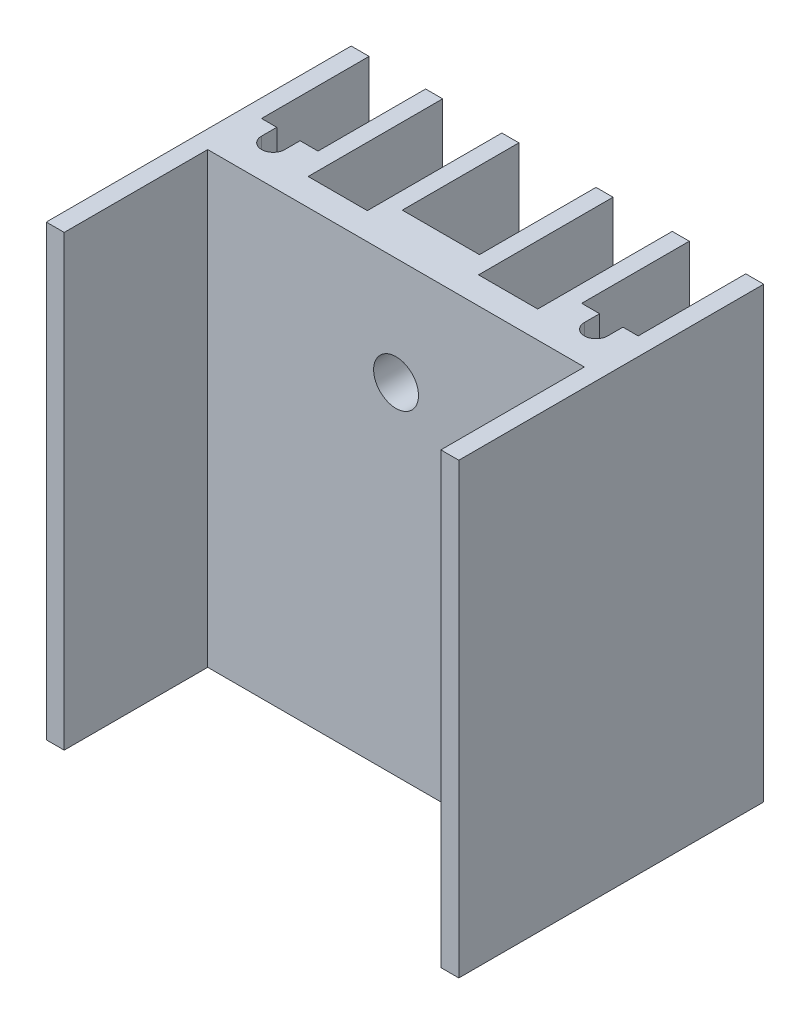
ISO-10303-21;
HEADER;
FILE_DESCRIPTION(('STEP AP214'),'2;1');
FILE_NAME('part.step','',(''),(''),'','','');
FILE_SCHEMA(('AUTOMOTIVE_DESIGN { 1 0 10303 214 1 1 1 1 }'));
ENDSEC;
DATA;
#1=APPLICATION_CONTEXT('core data for automotive mechanical design processes');
#2=APPLICATION_PROTOCOL_DEFINITION('international standard','automotive_design',2000,#1);
#3=PRODUCT_CONTEXT('',#1,'mechanical');
#4=PRODUCT('Part','Part','',(#3));
#5=PRODUCT_RELATED_PRODUCT_CATEGORY('part','',(#4));
#6=PRODUCT_DEFINITION_FORMATION('','',#4);
#7=PRODUCT_DEFINITION_CONTEXT('part definition',#1,'design');
#8=PRODUCT_DEFINITION('design','',#6,#7);
#9=PRODUCT_DEFINITION_SHAPE('','',#8);
#10=(LENGTH_UNIT() NAMED_UNIT(*) SI_UNIT(.MILLI.,.METRE.));
#11=(NAMED_UNIT(*) PLANE_ANGLE_UNIT() SI_UNIT($,.RADIAN.));
#12=(NAMED_UNIT(*) SI_UNIT($,.STERADIAN.) SOLID_ANGLE_UNIT());
#13=UNCERTAINTY_MEASURE_WITH_UNIT(LENGTH_MEASURE(1.E-05),#10,'distance_accuracy_value','');
#14=(GEOMETRIC_REPRESENTATION_CONTEXT(3) GLOBAL_UNCERTAINTY_ASSIGNED_CONTEXT((#13)) GLOBAL_UNIT_ASSIGNED_CONTEXT((#10,
#11,#12)) REPRESENTATION_CONTEXT('',''));
#15=CARTESIAN_POINT('',(0.,0.,0.));
#16=DIRECTION('',(0.,0.,1.));
#17=DIRECTION('',(1.,0.,0.));
#18=AXIS2_PLACEMENT_3D('',#15,#16,#17);
#19=CARTESIAN_POINT('',(-10.5,0.,-2.5));
#20=DIRECTION('',(0.,0.,1.));
#21=DIRECTION('',(1.,0.,0.));
#22=AXIS2_PLACEMENT_3D('',#19,#20,#21);
#23=PLANE('',#22);
#24=DIRECTION('',(1.,0.,0.));
#25=VECTOR('',#24,1.);
#26=CARTESIAN_POINT('',(-10.5,25.,-2.5));
#27=LINE('',#26,#25);
#28=CARTESIAN_POINT('',(-10.5,25.,-2.5));
#29=VERTEX_POINT('',#28);
#30=CARTESIAN_POINT('',(-9.65000000000002,25.,-2.49999999999993));
#31=VERTEX_POINT('',#30);
#32=EDGE_CURVE('E450',#29,#31,#27,.T.);
#33=ORIENTED_EDGE('',*,*,#32,.T.);
#34=DIRECTION('',(0.,1.,0.));
#35=VECTOR('',#34,1.);
#36=CARTESIAN_POINT('',(-9.65000000000002,0.,-2.49999999999993));
#37=LINE('',#36,#35);
#38=CARTESIAN_POINT('',(-9.65000000000002,0.,-2.49999999999993));
#39=VERTEX_POINT('',#38);
#40=EDGE_CURVE('E299',#39,#31,#37,.T.);
#41=ORIENTED_EDGE('',*,*,#40,.F.);
#42=DIRECTION('',(1.,0.,0.));
#43=VECTOR('',#42,1.);
#44=CARTESIAN_POINT('',(-10.5,0.,-2.5));
#45=LINE('',#44,#43);
#46=CARTESIAN_POINT('',(-10.5,0.,-2.5));
#47=VERTEX_POINT('',#46);
#48=EDGE_CURVE('E441',#47,#39,#45,.T.);
#49=ORIENTED_EDGE('',*,*,#48,.F.);
#50=DIRECTION('',(0.,1.,0.));
#51=VECTOR('',#50,1.);
#52=CARTESIAN_POINT('',(-10.5,0.,-2.5));
#53=LINE('',#52,#51);
#54=EDGE_CURVE('E446',#47,#29,#53,.T.);
#55=ORIENTED_EDGE('',*,*,#54,.T.);
#56=EDGE_LOOP('',(#33,#41,#49,#55));
#57=FACE_BOUND('',#56,.T.);
#58=ADVANCED_FACE('F33',(#57),#23,.F.);
#59=CARTESIAN_POINT('',(10.5,0.,-2.5));
#60=DIRECTION('',(0.,0.,1.));
#61=DIRECTION('',(1.,0.,0.));
#62=AXIS2_PLACEMENT_3D('',#59,#60,#61);
#63=PLANE('',#62);
#64=DIRECTION('',(1.,0.,0.));
#65=VECTOR('',#64,1.);
#66=CARTESIAN_POINT('',(10.5,0.,-2.5));
#67=LINE('',#66,#65);
#68=CARTESIAN_POINT('',(9.65,0.,-2.5));
#69=VERTEX_POINT('',#68);
#70=CARTESIAN_POINT('',(10.5,0.,-2.5));
#71=VERTEX_POINT('',#70);
#72=EDGE_CURVE('E329',#69,#71,#67,.T.);
#73=ORIENTED_EDGE('',*,*,#72,.F.);
#74=DIRECTION('',(0.,1.,0.));
#75=VECTOR('',#74,1.);
#76=CARTESIAN_POINT('',(9.65,0.,-2.5));
#77=LINE('',#76,#75);
#78=CARTESIAN_POINT('',(9.65,25.,-2.5));
#79=VERTEX_POINT('',#78);
#80=EDGE_CURVE('E317',#69,#79,#77,.T.);
#81=ORIENTED_EDGE('',*,*,#80,.T.);
#82=DIRECTION('',(1.,0.,0.));
#83=VECTOR('',#82,1.);
#84=CARTESIAN_POINT('',(10.5,25.,-2.5));
#85=LINE('',#84,#83);
#86=CARTESIAN_POINT('',(10.5,25.,-2.5));
#87=VERTEX_POINT('',#86);
#88=EDGE_CURVE('E340',#79,#87,#85,.T.);
#89=ORIENTED_EDGE('',*,*,#88,.T.);
#90=DIRECTION('',(0.,1.,0.));
#91=VECTOR('',#90,1.);
#92=CARTESIAN_POINT('',(10.5,0.,-2.5));
#93=LINE('',#92,#91);
#94=EDGE_CURVE('E349',#71,#87,#93,.T.);
#95=ORIENTED_EDGE('',*,*,#94,.F.);
#96=EDGE_LOOP('',(#73,#81,#89,#95));
#97=FACE_BOUND('',#96,.T.);
#98=ADVANCED_FACE('F632',(#97),#63,.F.);
#99=CARTESIAN_POINT('',(-11.5,25.,-8.5));
#100=DIRECTION('',(0.,0.,1.));
#101=DIRECTION('',(1.,0.,0.));
#102=AXIS2_PLACEMENT_3D('',#99,#100,#101);
#103=PLANE('',#102);
#104=DIRECTION('',(-1.,0.,0.));
#105=VECTOR('',#104,1.);
#106=CARTESIAN_POINT('',(-11.5,0.,-8.5));
#107=LINE('',#106,#105);
#108=CARTESIAN_POINT('',(11.5,0.,-8.5));
#109=VERTEX_POINT('',#108);
#110=CARTESIAN_POINT('',(10.5,0.,-8.5));
#111=VERTEX_POINT('',#110);
#112=EDGE_CURVE('E495',#109,#111,#107,.T.);
#113=ORIENTED_EDGE('',*,*,#112,.T.);
#114=DIRECTION('',(0.,1.,0.));
#115=VECTOR('',#114,1.);
#116=CARTESIAN_POINT('',(10.5,0.,-8.5));
#117=LINE('',#116,#115);
#118=CARTESIAN_POINT('',(10.5,25.,-8.5));
#119=VERTEX_POINT('',#118);
#120=EDGE_CURVE('E345',#111,#119,#117,.T.);
#121=ORIENTED_EDGE('',*,*,#120,.T.);
#122=DIRECTION('',(-1.,0.,0.));
#123=VECTOR('',#122,1.);
#124=CARTESIAN_POINT('',(-11.5,25.,-8.5));
#125=LINE('',#124,#123);
#126=CARTESIAN_POINT('',(11.5,25.,-8.5));
#127=VERTEX_POINT('',#126);
#128=EDGE_CURVE('E502',#127,#119,#125,.T.);
#129=ORIENTED_EDGE('',*,*,#128,.F.);
#130=DIRECTION('',(0.,-1.,0.));
#131=VECTOR('',#130,1.);
#132=CARTESIAN_POINT('',(11.5,25.,-8.5));
#133=LINE('',#132,#131);
#134=EDGE_CURVE('E521',#127,#109,#133,.T.);
#135=ORIENTED_EDGE('',*,*,#134,.T.);
#136=EDGE_LOOP('',(#113,#121,#129,#135));
#137=FACE_BOUND('',#136,.T.);
#138=ADVANCED_FACE('F536',(#137),#103,.F.);
#139=CARTESIAN_POINT('',(7.35,25.,-8.5));
#140=VERTEX_POINT('',#139);
#141=CARTESIAN_POINT('',(6.4,25.,-8.5));
#142=VERTEX_POINT('',#141);
#143=EDGE_CURVE('E506',#140,#142,#125,.T.);
#144=ORIENTED_EDGE('',*,*,#143,.F.);
#145=DIRECTION('',(0.,1.,0.));
#146=VECTOR('',#145,1.);
#147=CARTESIAN_POINT('',(7.35,0.,-8.5));
#148=LINE('',#147,#146);
#149=CARTESIAN_POINT('',(7.35,0.,-8.5));
#150=VERTEX_POINT('',#149);
#151=EDGE_CURVE('E337',#150,#140,#148,.T.);
#152=ORIENTED_EDGE('',*,*,#151,.F.);
#153=CARTESIAN_POINT('',(6.4,0.,-8.5));
#154=VERTEX_POINT('',#153);
#155=EDGE_CURVE('E518',#150,#154,#107,.T.);
#156=ORIENTED_EDGE('',*,*,#155,.T.);
#157=DIRECTION('',(0.,1.,0.));
#158=VECTOR('',#157,1.);
#159=CARTESIAN_POINT('',(6.4,0.,-8.5));
#160=LINE('',#159,#158);
#161=EDGE_CURVE('E373',#154,#142,#160,.T.);
#162=ORIENTED_EDGE('',*,*,#161,.T.);
#163=EDGE_LOOP('',(#144,#152,#156,#162));
#164=FACE_BOUND('',#163,.T.);
#165=ADVANCED_FACE('F588',(#164),#103,.F.);
#166=CARTESIAN_POINT('',(-2.15,25.,-8.5));
#167=VERTEX_POINT('',#166);
#168=CARTESIAN_POINT('',(-3.1,25.,-8.5));
#169=VERTEX_POINT('',#168);
#170=EDGE_CURVE('E604',#167,#169,#125,.T.);
#171=ORIENTED_EDGE('',*,*,#170,.F.);
#172=DIRECTION('',(0.,1.,0.));
#173=VECTOR('',#172,1.);
#174=CARTESIAN_POINT('',(-2.15,0.,-8.5));
#175=LINE('',#174,#173);
#176=CARTESIAN_POINT('',(-2.15,0.,-8.5));
#177=VERTEX_POINT('',#176);
#178=EDGE_CURVE('E400',#177,#167,#175,.T.);
#179=ORIENTED_EDGE('',*,*,#178,.F.);
#180=CARTESIAN_POINT('',(-3.1,0.,-8.5));
#181=VERTEX_POINT('',#180);
#182=EDGE_CURVE('E569',#177,#181,#107,.T.);
#183=ORIENTED_EDGE('',*,*,#182,.T.);
#184=DIRECTION('',(0.,1.,0.));
#185=VECTOR('',#184,1.);
#186=CARTESIAN_POINT('',(-3.1,0.,-8.5));
#187=LINE('',#186,#185);
#188=EDGE_CURVE('E430',#181,#169,#187,.T.);
#189=ORIENTED_EDGE('',*,*,#188,.T.);
#190=EDGE_LOOP('',(#171,#179,#183,#189));
#191=FACE_BOUND('',#190,.T.);
#192=ADVANCED_FACE('F622',(#191),#103,.F.);
#193=CARTESIAN_POINT('',(-6.4,25.,-8.5));
#194=VERTEX_POINT('',#193);
#195=CARTESIAN_POINT('',(-7.35,25.,-8.5));
#196=VERTEX_POINT('',#195);
#197=EDGE_CURVE('E606',#194,#196,#125,.T.);
#198=ORIENTED_EDGE('',*,*,#197,.F.);
#199=DIRECTION('',(0.,1.,0.));
#200=VECTOR('',#199,1.);
#201=CARTESIAN_POINT('',(-6.4,0.,-8.5));
#202=LINE('',#201,#200);
#203=CARTESIAN_POINT('',(-6.4,0.,-8.5));
#204=VERTEX_POINT('',#203);
#205=EDGE_CURVE('E427',#204,#194,#202,.T.);
#206=ORIENTED_EDGE('',*,*,#205,.F.);
#207=CARTESIAN_POINT('',(-7.35,0.,-8.5));
#208=VERTEX_POINT('',#207);
#209=EDGE_CURVE('E568',#204,#208,#107,.T.);
#210=ORIENTED_EDGE('',*,*,#209,.T.);
#211=DIRECTION('',(0.,1.,0.));
#212=VECTOR('',#211,1.);
#213=CARTESIAN_POINT('',(-7.35,0.,-8.5));
#214=LINE('',#213,#212);
#215=EDGE_CURVE('E458',#208,#196,#214,.T.);
#216=ORIENTED_EDGE('',*,*,#215,.T.);
#217=EDGE_LOOP('',(#198,#206,#210,#216));
#218=FACE_BOUND('',#217,.T.);
#219=ADVANCED_FACE('F619',(#218),#103,.F.);
#220=CARTESIAN_POINT('',(-10.5,25.,-8.5));
#221=VERTEX_POINT('',#220);
#222=CARTESIAN_POINT('',(-11.5,25.,-8.5));
#223=VERTEX_POINT('',#222);
#224=EDGE_CURVE('E501',#221,#223,#125,.T.);
#225=ORIENTED_EDGE('',*,*,#224,.F.);
#226=DIRECTION('',(0.,1.,0.));
#227=VECTOR('',#226,1.);
#228=CARTESIAN_POINT('',(-10.5,0.,-8.5));
#229=LINE('',#228,#227);
#230=CARTESIAN_POINT('',(-10.5,0.,-8.5));
#231=VERTEX_POINT('',#230);
#232=EDGE_CURVE('E455',#231,#221,#229,.T.);
#233=ORIENTED_EDGE('',*,*,#232,.F.);
#234=CARTESIAN_POINT('',(-11.5,0.,-8.5));
#235=VERTEX_POINT('',#234);
#236=EDGE_CURVE('E515',#231,#235,#107,.T.);
#237=ORIENTED_EDGE('',*,*,#236,.T.);
#238=DIRECTION('',(0.,-1.,0.));
#239=VECTOR('',#238,1.);
#240=CARTESIAN_POINT('',(-11.5,25.,-8.5));
#241=LINE('',#240,#239);
#242=EDGE_CURVE('E505',#223,#235,#241,.T.);
#243=ORIENTED_EDGE('',*,*,#242,.F.);
#244=EDGE_LOOP('',(#225,#233,#237,#243));
#245=FACE_BOUND('',#244,.T.);
#246=ADVANCED_FACE('F621',(#245),#103,.F.);
#247=CARTESIAN_POINT('',(-11.5,25.,8.5));
#248=DIRECTION('',(0.,0.,-1.));
#249=DIRECTION('',(-1.,0.,0.));
#250=AXIS2_PLACEMENT_3D('',#247,#248,#249);
#251=PLANE('',#250);
#252=DIRECTION('',(1.,0.,0.));
#253=VECTOR('',#252,1.);
#254=CARTESIAN_POINT('',(-11.5,0.,8.5));
#255=LINE('',#254,#253);
#256=CARTESIAN_POINT('',(-11.5,0.,8.5));
#257=VERTEX_POINT('',#256);
#258=CARTESIAN_POINT('',(-10.5,0.,8.5));
#259=VERTEX_POINT('',#258);
#260=EDGE_CURVE('E510',#257,#259,#255,.T.);
#261=ORIENTED_EDGE('',*,*,#260,.T.);
#262=DIRECTION('',(0.,1.,0.));
#263=VECTOR('',#262,1.);
#264=CARTESIAN_POINT('',(-10.5,0.,8.5));
#265=LINE('',#264,#263);
#266=CARTESIAN_POINT('',(-10.5,25.,8.5));
#267=VERTEX_POINT('',#266);
#268=EDGE_CURVE('E475',#259,#267,#265,.T.);
#269=ORIENTED_EDGE('',*,*,#268,.T.);
#270=DIRECTION('',(1.,0.,0.));
#271=VECTOR('',#270,1.);
#272=CARTESIAN_POINT('',(-11.5,25.,8.5));
#273=LINE('',#272,#271);
#274=CARTESIAN_POINT('',(-11.5,25.,8.5));
#275=VERTEX_POINT('',#274);
#276=EDGE_CURVE('E496',#275,#267,#273,.T.);
#277=ORIENTED_EDGE('',*,*,#276,.F.);
#278=DIRECTION('',(0.,-1.,0.));
#279=VECTOR('',#278,1.);
#280=CARTESIAN_POINT('',(-11.5,25.,8.5));
#281=LINE('',#280,#279);
#282=EDGE_CURVE('E11',#275,#257,#281,.T.);
#283=ORIENTED_EDGE('',*,*,#282,.T.);
#284=EDGE_LOOP('',(#261,#269,#277,#283));
#285=FACE_BOUND('',#284,.T.);
#286=ADVANCED_FACE('F557',(#285),#251,.F.);
#287=CARTESIAN_POINT('',(-11.5,25.,-8.5));
#288=DIRECTION('',(1.,0.,0.));
#289=DIRECTION('',(0.,0.,-1.));
#290=AXIS2_PLACEMENT_3D('',#287,#288,#289);
#291=PLANE('',#290);
#292=DIRECTION('',(0.,0.,1.));
#293=VECTOR('',#292,1.);
#294=CARTESIAN_POINT('',(-11.5,0.,-8.5));
#295=LINE('',#294,#293);
#296=EDGE_CURVE('E484',#235,#257,#295,.T.);
#297=ORIENTED_EDGE('',*,*,#296,.T.);
#298=ORIENTED_EDGE('',*,*,#282,.F.);
#299=DIRECTION('',(0.,0.,1.));
#300=VECTOR('',#299,1.);
#301=CARTESIAN_POINT('',(-11.5,25.,-8.5));
#302=LINE('',#301,#300);
#303=EDGE_CURVE('E491',#223,#275,#302,.T.);
#304=ORIENTED_EDGE('',*,*,#303,.F.);
#305=ORIENTED_EDGE('',*,*,#242,.T.);
#306=EDGE_LOOP('',(#297,#298,#304,#305));
#307=FACE_BOUND('',#306,.T.);
#308=ADVANCED_FACE('F35',(#307),#291,.F.);
#309=CARTESIAN_POINT('',(10.5,25.,8.5));
#310=VERTEX_POINT('',#309);
#311=CARTESIAN_POINT('',(11.5,25.,8.5));
#312=VERTEX_POINT('',#311);
#313=EDGE_CURVE('E494',#310,#312,#273,.T.);
#314=ORIENTED_EDGE('',*,*,#313,.F.);
#315=DIRECTION('',(0.,1.,0.));
#316=VECTOR('',#315,1.);
#317=CARTESIAN_POINT('',(10.5,0.,8.5));
#318=LINE('',#317,#316);
#319=CARTESIAN_POINT('',(10.5,0.,8.5));
#320=VERTEX_POINT('',#319);
#321=EDGE_CURVE('E487',#320,#310,#318,.T.);
#322=ORIENTED_EDGE('',*,*,#321,.F.);
#323=CARTESIAN_POINT('',(11.5,0.,8.5));
#324=VERTEX_POINT('',#323);
#325=EDGE_CURVE('E509',#320,#324,#255,.T.);
#326=ORIENTED_EDGE('',*,*,#325,.T.);
#327=DIRECTION('',(0.,-1.,0.));
#328=VECTOR('',#327,1.);
#329=CARTESIAN_POINT('',(11.5,25.,8.5));
#330=LINE('',#329,#328);
#331=EDGE_CURVE('E41',#312,#324,#330,.T.);
#332=ORIENTED_EDGE('',*,*,#331,.F.);
#333=EDGE_LOOP('',(#314,#322,#326,#332));
#334=FACE_BOUND('',#333,.T.);
#335=ADVANCED_FACE('F546',(#334),#251,.F.);
#336=CARTESIAN_POINT('',(11.5,25.,-8.5));
#337=DIRECTION('',(-1.,0.,0.));
#338=DIRECTION('',(0.,0.,1.));
#339=AXIS2_PLACEMENT_3D('',#336,#337,#338);
#340=PLANE('',#339);
#341=DIRECTION('',(0.,0.,-1.));
#342=VECTOR('',#341,1.);
#343=CARTESIAN_POINT('',(11.5,0.,-8.5));
#344=LINE('',#343,#342);
#345=EDGE_CURVE('E513',#324,#109,#344,.T.);
#346=ORIENTED_EDGE('',*,*,#345,.T.);
#347=ORIENTED_EDGE('',*,*,#134,.F.);
#348=DIRECTION('',(0.,0.,-1.));
#349=VECTOR('',#348,1.);
#350=CARTESIAN_POINT('',(11.5,25.,-8.5));
#351=LINE('',#350,#349);
#352=EDGE_CURVE('E499',#312,#127,#351,.T.);
#353=ORIENTED_EDGE('',*,*,#352,.F.);
#354=ORIENTED_EDGE('',*,*,#331,.T.);
#355=EDGE_LOOP('',(#346,#347,#353,#354));
#356=FACE_BOUND('',#355,.T.);
#357=ADVANCED_FACE('F528',(#356),#340,.F.);
#358=CARTESIAN_POINT('',(3.1,25.,-8.5));
#359=VERTEX_POINT('',#358);
#360=CARTESIAN_POINT('',(2.15,25.,-8.5));
#361=VERTEX_POINT('',#360);
#362=EDGE_CURVE('E603',#359,#361,#125,.T.);
#363=ORIENTED_EDGE('',*,*,#362,.F.);
#364=DIRECTION('',(0.,1.,0.));
#365=VECTOR('',#364,1.);
#366=CARTESIAN_POINT('',(3.1,0.,-8.5));
#367=LINE('',#366,#365);
#368=CARTESIAN_POINT('',(3.1,0.,-8.5));
#369=VERTEX_POINT('',#368);
#370=EDGE_CURVE('E365',#369,#359,#367,.T.);
#371=ORIENTED_EDGE('',*,*,#370,.F.);
#372=CARTESIAN_POINT('',(2.15,0.,-8.5));
#373=VERTEX_POINT('',#372);
#374=EDGE_CURVE('E574',#369,#373,#107,.T.);
#375=ORIENTED_EDGE('',*,*,#374,.T.);
#376=DIRECTION('',(0.,1.,0.));
#377=VECTOR('',#376,1.);
#378=CARTESIAN_POINT('',(2.15,0.,-8.5));
#379=LINE('',#378,#377);
#380=EDGE_CURVE('E403',#373,#361,#379,.T.);
#381=ORIENTED_EDGE('',*,*,#380,.T.);
#382=EDGE_LOOP('',(#363,#371,#375,#381));
#383=FACE_BOUND('',#382,.T.);
#384=ADVANCED_FACE('F628',(#383),#103,.F.);
#385=CARTESIAN_POINT('',(0.,25.,0.));
#386=DIRECTION('',(0.,1.,0.));
#387=DIRECTION('',(0.,0.,1.));
#388=AXIS2_PLACEMENT_3D('',#385,#386,#387);
#389=PLANE('',#388);
#390=DIRECTION('',(0.,0.,1.));
#391=VECTOR('',#390,1.);
#392=CARTESIAN_POINT('',(-9.65000000000001,25.,-1.64999999999993));
#393=LINE('',#392,#391);
#394=CARTESIAN_POINT('',(-9.65000000000001,25.,-1.64999999999993));
#395=VERTEX_POINT('',#394);
#396=EDGE_CURVE('E285',#31,#395,#393,.T.);
#397=ORIENTED_EDGE('',*,*,#396,.F.);
#398=ORIENTED_EDGE('',*,*,#32,.F.);
#399=DIRECTION('',(0.,0.,1.));
#400=VECTOR('',#399,1.);
#401=CARTESIAN_POINT('',(-10.5,25.,-8.5));
#402=LINE('',#401,#400);
#403=EDGE_CURVE('E429',#221,#29,#402,.T.);
#404=ORIENTED_EDGE('',*,*,#403,.F.);
#405=ORIENTED_EDGE('',*,*,#224,.T.);
#406=ORIENTED_EDGE('',*,*,#303,.T.);
#407=ORIENTED_EDGE('',*,*,#276,.T.);
#408=DIRECTION('',(0.,0.,1.));
#409=VECTOR('',#408,1.);
#410=CARTESIAN_POINT('',(-10.5,25.,8.5));
#411=LINE('',#410,#409);
#412=CARTESIAN_POINT('',(-10.5,25.,0.5));
#413=VERTEX_POINT('',#412);
#414=EDGE_CURVE('E457',#413,#267,#411,.T.);
#415=ORIENTED_EDGE('',*,*,#414,.F.);
#416=DIRECTION('',(-1.,0.,0.));
#417=VECTOR('',#416,1.);
#418=CARTESIAN_POINT('',(-10.5,25.,0.5));
#419=LINE('',#418,#417);
#420=CARTESIAN_POINT('',(10.5,25.,0.5));
#421=VERTEX_POINT('',#420);
#422=EDGE_CURVE('E469',#421,#413,#419,.T.);
#423=ORIENTED_EDGE('',*,*,#422,.F.);
#424=DIRECTION('',(0.,0.,-1.));
#425=VECTOR('',#424,1.);
#426=CARTESIAN_POINT('',(10.5,25.,8.5));
#427=LINE('',#426,#425);
#428=EDGE_CURVE('E477',#310,#421,#427,.T.);
#429=ORIENTED_EDGE('',*,*,#428,.F.);
#430=ORIENTED_EDGE('',*,*,#313,.T.);
#431=ORIENTED_EDGE('',*,*,#352,.T.);
#432=ORIENTED_EDGE('',*,*,#128,.T.);
#433=DIRECTION('',(0.,0.,-1.));
#434=VECTOR('',#433,1.);
#435=CARTESIAN_POINT('',(10.5,25.,-8.5));
#436=LINE('',#435,#434);
#437=EDGE_CURVE('E330',#87,#119,#436,.T.);
#438=ORIENTED_EDGE('',*,*,#437,.F.);
#439=ORIENTED_EDGE('',*,*,#88,.F.);
#440=DIRECTION('',(0.,0.,-1.));
#441=VECTOR('',#440,1.);
#442=CARTESIAN_POINT('',(9.65,25.,-1.65));
#443=LINE('',#442,#441);
#444=CARTESIAN_POINT('',(9.65,25.,-1.65));
#445=VERTEX_POINT('',#444);
#446=EDGE_CURVE('E304',#445,#79,#443,.T.);
#447=ORIENTED_EDGE('',*,*,#446,.F.);
#448=CARTESIAN_POINT('',(9.,25.,-1.65));
#449=DIRECTION('',(0.,1.,0.));
#450=DIRECTION('',(0.,0.,1.));
#451=AXIS2_PLACEMENT_3D('',#448,#449,#450);
#452=CIRCLE('',#451,0.65);
#453=CARTESIAN_POINT('',(8.35,25.,-1.65));
#454=VERTEX_POINT('',#453);
#455=EDGE_CURVE('E313',#454,#445,#452,.T.);
#456=ORIENTED_EDGE('',*,*,#455,.F.);
#457=DIRECTION('',(0.,0.,1.));
#458=VECTOR('',#457,1.);
#459=CARTESIAN_POINT('',(8.35,25.,-2.5));
#460=LINE('',#459,#458);
#461=CARTESIAN_POINT('',(8.35,25.,-2.5));
#462=VERTEX_POINT('',#461);
#463=EDGE_CURVE('E298',#462,#454,#460,.T.);
#464=ORIENTED_EDGE('',*,*,#463,.F.);
#465=CARTESIAN_POINT('',(7.35,25.,-2.5));
#466=VERTEX_POINT('',#465);
#467=EDGE_CURVE('E341',#466,#462,#85,.T.);
#468=ORIENTED_EDGE('',*,*,#467,.F.);
#469=DIRECTION('',(0.,0.,1.));
#470=VECTOR('',#469,1.);
#471=CARTESIAN_POINT('',(7.35,25.,-8.5));
#472=LINE('',#471,#470);
#473=EDGE_CURVE('E320',#140,#466,#472,.T.);
#474=ORIENTED_EDGE('',*,*,#473,.F.);
#475=ORIENTED_EDGE('',*,*,#143,.T.);
#476=DIRECTION('',(0.,0.,-1.));
#477=VECTOR('',#476,1.);
#478=CARTESIAN_POINT('',(6.4,25.,-8.5));
#479=LINE('',#478,#477);
#480=CARTESIAN_POINT('',(6.4,25.,-1.));
#481=VERTEX_POINT('',#480);
#482=EDGE_CURVE('E359',#481,#142,#479,.T.);
#483=ORIENTED_EDGE('',*,*,#482,.F.);
#484=DIRECTION('',(1.,0.,0.));
#485=VECTOR('',#484,1.);
#486=CARTESIAN_POINT('',(6.4,25.,-1.));
#487=LINE('',#486,#485);
#488=CARTESIAN_POINT('',(3.1,25.,-1.));
#489=VERTEX_POINT('',#488);
#490=EDGE_CURVE('E368',#489,#481,#487,.T.);
#491=ORIENTED_EDGE('',*,*,#490,.F.);
#492=DIRECTION('',(0.,0.,1.));
#493=VECTOR('',#492,1.);
#494=CARTESIAN_POINT('',(3.1,25.,-8.5));
#495=LINE('',#494,#493);
#496=EDGE_CURVE('E348',#359,#489,#495,.T.);
#497=ORIENTED_EDGE('',*,*,#496,.F.);
#498=ORIENTED_EDGE('',*,*,#362,.T.);
#499=DIRECTION('',(0.,0.,-1.));
#500=VECTOR('',#499,1.);
#501=CARTESIAN_POINT('',(2.15,25.,-8.5));
#502=LINE('',#501,#500);
#503=CARTESIAN_POINT('',(2.15,25.,-2.));
#504=VERTEX_POINT('',#503);
#505=EDGE_CURVE('E386',#504,#361,#502,.T.);
#506=ORIENTED_EDGE('',*,*,#505,.F.);
#507=DIRECTION('',(1.,0.,0.));
#508=VECTOR('',#507,1.);
#509=CARTESIAN_POINT('',(-2.15,25.,-2.));
#510=LINE('',#509,#508);
#511=CARTESIAN_POINT('',(-2.15,25.,-2.));
#512=VERTEX_POINT('',#511);
#513=EDGE_CURVE('E395',#512,#504,#510,.T.);
#514=ORIENTED_EDGE('',*,*,#513,.F.);
#515=DIRECTION('',(0.,0.,1.));
#516=VECTOR('',#515,1.);
#517=CARTESIAN_POINT('',(-2.15,25.,-8.5));
#518=LINE('',#517,#516);
#519=EDGE_CURVE('E376',#167,#512,#518,.T.);
#520=ORIENTED_EDGE('',*,*,#519,.F.);
#521=ORIENTED_EDGE('',*,*,#170,.T.);
#522=DIRECTION('',(0.,0.,-1.));
#523=VECTOR('',#522,1.);
#524=CARTESIAN_POINT('',(-3.1,25.,-8.5));
#525=LINE('',#524,#523);
#526=CARTESIAN_POINT('',(-3.1,25.,-1.));
#527=VERTEX_POINT('',#526);
#528=EDGE_CURVE('E413',#527,#169,#525,.T.);
#529=ORIENTED_EDGE('',*,*,#528,.F.);
#530=DIRECTION('',(1.,0.,0.));
#531=VECTOR('',#530,1.);
#532=CARTESIAN_POINT('',(-6.4,25.,-1.));
#533=LINE('',#532,#531);
#534=CARTESIAN_POINT('',(-6.4,25.,-1.));
#535=VERTEX_POINT('',#534);
#536=EDGE_CURVE('E422',#535,#527,#533,.T.);
#537=ORIENTED_EDGE('',*,*,#536,.F.);
#538=DIRECTION('',(0.,0.,1.));
#539=VECTOR('',#538,1.);
#540=CARTESIAN_POINT('',(-6.4,25.,-8.5));
#541=LINE('',#540,#539);
#542=EDGE_CURVE('E402',#194,#535,#541,.T.);
#543=ORIENTED_EDGE('',*,*,#542,.F.);
#544=ORIENTED_EDGE('',*,*,#197,.T.);
#545=DIRECTION('',(0.,0.,-1.));
#546=VECTOR('',#545,1.);
#547=CARTESIAN_POINT('',(-7.35,25.,-8.5));
#548=LINE('',#547,#546);
#549=CARTESIAN_POINT('',(-7.35,25.,-2.5));
#550=VERTEX_POINT('',#549);
#551=EDGE_CURVE('E440',#550,#196,#548,.T.);
#552=ORIENTED_EDGE('',*,*,#551,.F.);
#553=CARTESIAN_POINT('',(-8.35000000000001,25.,-2.5));
#554=VERTEX_POINT('',#553);
#555=EDGE_CURVE('E449',#554,#550,#27,.T.);
#556=ORIENTED_EDGE('',*,*,#555,.F.);
#557=DIRECTION('',(0.,0.,-1.));
#558=VECTOR('',#557,1.);
#559=CARTESIAN_POINT('',(-8.35000000000002,25.,-2.49999999999994));
#560=LINE('',#559,#558);
#561=CARTESIAN_POINT('',(-8.35000000000001,25.,-1.64999999999994));
#562=VERTEX_POINT('',#561);
#563=EDGE_CURVE('E48',#562,#554,#560,.T.);
#564=ORIENTED_EDGE('',*,*,#563,.F.);
#565=CARTESIAN_POINT('',(-9.00000000000001,25.,-1.64999999999994));
#566=DIRECTION('',(0.,1.,0.));
#567=DIRECTION('',(0.,0.,-1.));
#568=AXIS2_PLACEMENT_3D('',#565,#566,#567);
#569=CIRCLE('',#568,0.65);
#570=EDGE_CURVE('E273',#395,#562,#569,.T.);
#571=ORIENTED_EDGE('',*,*,#570,.F.);
#572=EDGE_LOOP('',(#397,#398,#404,#405,#406,#407,#415,#423,#429,#430,#431,#432,#438,#439,#447,
#456,#464,#468,#474,#475,#483,#491,#497,#498,#506,#514,#520,#521,#529,#537,#543,#544,#552,#556,
#564,#571));
#573=FACE_BOUND('',#572,.T.);
#574=ADVANCED_FACE('F541',(#573),#389,.T.);
#575=CARTESIAN_POINT('',(0.,0.,0.));
#576=DIRECTION('',(0.,1.,0.));
#577=DIRECTION('',(0.,0.,1.));
#578=AXIS2_PLACEMENT_3D('',#575,#576,#577);
#579=PLANE('',#578);
#580=ORIENTED_EDGE('',*,*,#48,.T.);
#581=DIRECTION('',(0.,0.,1.));
#582=VECTOR('',#581,1.);
#583=CARTESIAN_POINT('',(-9.65000000000001,0.,-1.64999999999993));
#584=LINE('',#583,#582);
#585=CARTESIAN_POINT('',(-9.65000000000001,0.,-1.64999999999993));
#586=VERTEX_POINT('',#585);
#587=EDGE_CURVE('E275',#39,#586,#584,.T.);
#588=ORIENTED_EDGE('',*,*,#587,.T.);
#589=CARTESIAN_POINT('',(-9.00000000000001,0.,-1.64999999999994));
#590=DIRECTION('',(0.,1.,0.));
#591=DIRECTION('',(0.,0.,-1.));
#592=AXIS2_PLACEMENT_3D('',#589,#590,#591);
#593=CIRCLE('',#592,0.65);
#594=CARTESIAN_POINT('',(-8.35000000000001,0.,-1.64999999999994));
#595=VERTEX_POINT('',#594);
#596=EDGE_CURVE('E270',#586,#595,#593,.T.);
#597=ORIENTED_EDGE('',*,*,#596,.T.);
#598=DIRECTION('',(0.,0.,-1.));
#599=VECTOR('',#598,1.);
#600=CARTESIAN_POINT('',(-8.35000000000002,0.,-2.49999999999994));
#601=LINE('',#600,#599);
#602=CARTESIAN_POINT('',(-8.35000000000002,0.,-2.49999999999994));
#603=VERTEX_POINT('',#602);
#604=EDGE_CURVE('E278',#595,#603,#601,.T.);
#605=ORIENTED_EDGE('',*,*,#604,.T.);
#606=CARTESIAN_POINT('',(-7.35,0.,-2.5));
#607=VERTEX_POINT('',#606);
#608=EDGE_CURVE('E439',#603,#607,#45,.T.);
#609=ORIENTED_EDGE('',*,*,#608,.T.);
#610=DIRECTION('',(0.,0.,-1.));
#611=VECTOR('',#610,1.);
#612=CARTESIAN_POINT('',(-7.35,0.,-8.5));
#613=LINE('',#612,#611);
#614=EDGE_CURVE('E443',#607,#208,#613,.T.);
#615=ORIENTED_EDGE('',*,*,#614,.T.);
#616=ORIENTED_EDGE('',*,*,#209,.F.);
#617=DIRECTION('',(0.,0.,1.));
#618=VECTOR('',#617,1.);
#619=CARTESIAN_POINT('',(-6.4,0.,-8.5));
#620=LINE('',#619,#618);
#621=CARTESIAN_POINT('',(-6.4,0.,-1.));
#622=VERTEX_POINT('',#621);
#623=EDGE_CURVE('E409',#204,#622,#620,.T.);
#624=ORIENTED_EDGE('',*,*,#623,.T.);
#625=DIRECTION('',(1.,0.,0.));
#626=VECTOR('',#625,1.);
#627=CARTESIAN_POINT('',(-6.4,0.,-1.));
#628=LINE('',#627,#626);
#629=CARTESIAN_POINT('',(-3.1,0.,-1.));
#630=VERTEX_POINT('',#629);
#631=EDGE_CURVE('E412',#622,#630,#628,.T.);
#632=ORIENTED_EDGE('',*,*,#631,.T.);
#633=DIRECTION('',(0.,0.,-1.));
#634=VECTOR('',#633,1.);
#635=CARTESIAN_POINT('',(-3.1,0.,-8.5));
#636=LINE('',#635,#634);
#637=EDGE_CURVE('E416',#630,#181,#636,.T.);
#638=ORIENTED_EDGE('',*,*,#637,.T.);
#639=ORIENTED_EDGE('',*,*,#182,.F.);
#640=DIRECTION('',(0.,0.,1.));
#641=VECTOR('',#640,1.);
#642=CARTESIAN_POINT('',(-2.15,0.,-8.5));
#643=LINE('',#642,#641);
#644=CARTESIAN_POINT('',(-2.15,0.,-2.));
#645=VERTEX_POINT('',#644);
#646=EDGE_CURVE('E382',#177,#645,#643,.T.);
#647=ORIENTED_EDGE('',*,*,#646,.T.);
#648=DIRECTION('',(1.,0.,0.));
#649=VECTOR('',#648,1.);
#650=CARTESIAN_POINT('',(-2.15,0.,-2.));
#651=LINE('',#650,#649);
#652=CARTESIAN_POINT('',(2.15,0.,-2.));
#653=VERTEX_POINT('',#652);
#654=EDGE_CURVE('E385',#645,#653,#651,.T.);
#655=ORIENTED_EDGE('',*,*,#654,.T.);
#656=DIRECTION('',(0.,0.,-1.));
#657=VECTOR('',#656,1.);
#658=CARTESIAN_POINT('',(2.15,0.,-8.5));
#659=LINE('',#658,#657);
#660=EDGE_CURVE('E389',#653,#373,#659,.T.);
#661=ORIENTED_EDGE('',*,*,#660,.T.);
#662=ORIENTED_EDGE('',*,*,#374,.F.);
#663=DIRECTION('',(0.,0.,1.));
#664=VECTOR('',#663,1.);
#665=CARTESIAN_POINT('',(3.1,0.,-8.5));
#666=LINE('',#665,#664);
#667=CARTESIAN_POINT('',(3.1,0.,-1.));
#668=VERTEX_POINT('',#667);
#669=EDGE_CURVE('E355',#369,#668,#666,.T.);
#670=ORIENTED_EDGE('',*,*,#669,.T.);
#671=DIRECTION('',(1.,0.,0.));
#672=VECTOR('',#671,1.);
#673=CARTESIAN_POINT('',(6.4,0.,-1.));
#674=LINE('',#673,#672);
#675=CARTESIAN_POINT('',(6.4,0.,-1.));
#676=VERTEX_POINT('',#675);
#677=EDGE_CURVE('E358',#668,#676,#674,.T.);
#678=ORIENTED_EDGE('',*,*,#677,.T.);
#679=DIRECTION('',(0.,0.,-1.));
#680=VECTOR('',#679,1.);
#681=CARTESIAN_POINT('',(6.4,0.,-8.5));
#682=LINE('',#681,#680);
#683=EDGE_CURVE('E362',#676,#154,#682,.T.);
#684=ORIENTED_EDGE('',*,*,#683,.T.);
#685=ORIENTED_EDGE('',*,*,#155,.F.);
#686=DIRECTION('',(0.,0.,1.));
#687=VECTOR('',#686,1.);
#688=CARTESIAN_POINT('',(7.35,0.,-8.5));
#689=LINE('',#688,#687);
#690=CARTESIAN_POINT('',(7.35,0.,-2.5));
#691=VERTEX_POINT('',#690);
#692=EDGE_CURVE('E326',#150,#691,#689,.T.);
#693=ORIENTED_EDGE('',*,*,#692,.T.);
#694=CARTESIAN_POINT('',(8.35,0.,-2.5));
#695=VERTEX_POINT('',#694);
#696=EDGE_CURVE('E331',#691,#695,#67,.T.);
#697=ORIENTED_EDGE('',*,*,#696,.T.);
#698=DIRECTION('',(0.,0.,1.));
#699=VECTOR('',#698,1.);
#700=CARTESIAN_POINT('',(8.35,0.,-2.5));
#701=LINE('',#700,#699);
#702=CARTESIAN_POINT('',(8.35,0.,-1.65));
#703=VERTEX_POINT('',#702);
#704=EDGE_CURVE('E56',#695,#703,#701,.T.);
#705=ORIENTED_EDGE('',*,*,#704,.T.);
#706=CARTESIAN_POINT('',(9.,0.,-1.65));
#707=DIRECTION('',(0.,1.,0.));
#708=DIRECTION('',(0.,0.,1.));
#709=AXIS2_PLACEMENT_3D('',#706,#707,#708);
#710=CIRCLE('',#709,0.65);
#711=CARTESIAN_POINT('',(9.65,0.,-1.65));
#712=VERTEX_POINT('',#711);
#713=EDGE_CURVE('E303',#703,#712,#710,.T.);
#714=ORIENTED_EDGE('',*,*,#713,.T.);
#715=DIRECTION('',(0.,0.,-1.));
#716=VECTOR('',#715,1.);
#717=CARTESIAN_POINT('',(9.65,0.,-1.65));
#718=LINE('',#717,#716);
#719=EDGE_CURVE('E307',#712,#69,#718,.T.);
#720=ORIENTED_EDGE('',*,*,#719,.T.);
#721=ORIENTED_EDGE('',*,*,#72,.T.);
#722=DIRECTION('',(0.,0.,-1.));
#723=VECTOR('',#722,1.);
#724=CARTESIAN_POINT('',(10.5,0.,-8.5));
#725=LINE('',#724,#723);
#726=EDGE_CURVE('E334',#71,#111,#725,.T.);
#727=ORIENTED_EDGE('',*,*,#726,.T.);
#728=ORIENTED_EDGE('',*,*,#112,.F.);
#729=ORIENTED_EDGE('',*,*,#345,.F.);
#730=ORIENTED_EDGE('',*,*,#325,.F.);
#731=DIRECTION('',(0.,0.,-1.));
#732=VECTOR('',#731,1.);
#733=CARTESIAN_POINT('',(10.5,0.,8.5));
#734=LINE('',#733,#732);
#735=CARTESIAN_POINT('',(10.5,0.,0.5));
#736=VERTEX_POINT('',#735);
#737=EDGE_CURVE('E468',#320,#736,#734,.T.);
#738=ORIENTED_EDGE('',*,*,#737,.T.);
#739=DIRECTION('',(-1.,0.,0.));
#740=VECTOR('',#739,1.);
#741=CARTESIAN_POINT('',(-10.5,0.,0.5));
#742=LINE('',#741,#740);
#743=CARTESIAN_POINT('',(-10.5,0.,0.5));
#744=VERTEX_POINT('',#743);
#745=EDGE_CURVE('E472',#736,#744,#742,.T.);
#746=ORIENTED_EDGE('',*,*,#745,.T.);
#747=DIRECTION('',(0.,0.,1.));
#748=VECTOR('',#747,1.);
#749=CARTESIAN_POINT('',(-10.5,0.,8.5));
#750=LINE('',#749,#748);
#751=EDGE_CURVE('E465',#744,#259,#750,.T.);
#752=ORIENTED_EDGE('',*,*,#751,.T.);
#753=ORIENTED_EDGE('',*,*,#260,.F.);
#754=ORIENTED_EDGE('',*,*,#296,.F.);
#755=ORIENTED_EDGE('',*,*,#236,.F.);
#756=DIRECTION('',(0.,0.,1.));
#757=VECTOR('',#756,1.);
#758=CARTESIAN_POINT('',(-10.5,0.,-8.5));
#759=LINE('',#758,#757);
#760=EDGE_CURVE('E436',#231,#47,#759,.T.);
#761=ORIENTED_EDGE('',*,*,#760,.T.);
#762=EDGE_LOOP('',(#580,#588,#597,#605,#609,#615,#616,#624,#632,#638,#639,#647,#655,#661,#662,
#670,#678,#684,#685,#693,#697,#705,#714,#720,#721,#727,#728,#729,#730,#738,#746,#752,#753,#754,
#755,#761));
#763=FACE_BOUND('',#762,.T.);
#764=ADVANCED_FACE('F284',(#763),#579,.F.);
#765=CARTESIAN_POINT('',(-10.5,0.,8.5));
#766=DIRECTION('',(-1.,0.,0.));
#767=DIRECTION('',(0.,0.,1.));
#768=AXIS2_PLACEMENT_3D('',#765,#766,#767);
#769=PLANE('',#768);
#770=ORIENTED_EDGE('',*,*,#414,.T.);
#771=ORIENTED_EDGE('',*,*,#268,.F.);
#772=ORIENTED_EDGE('',*,*,#751,.F.);
#773=DIRECTION('',(0.,1.,0.));
#774=VECTOR('',#773,1.);
#775=CARTESIAN_POINT('',(-10.5,0.,0.5));
#776=LINE('',#775,#774);
#777=EDGE_CURVE('E482',#744,#413,#776,.T.);
#778=ORIENTED_EDGE('',*,*,#777,.T.);
#779=EDGE_LOOP('',(#770,#771,#772,#778));
#780=FACE_BOUND('',#779,.T.);
#781=ADVANCED_FACE('F555',(#780),#769,.F.);
#782=CARTESIAN_POINT('',(-10.5,0.,0.5));
#783=DIRECTION('',(0.,0.,-1.));
#784=DIRECTION('',(-1.,0.,0.));
#785=AXIS2_PLACEMENT_3D('',#782,#783,#784);
#786=PLANE('',#785);
#787=CARTESIAN_POINT('',(0.,19.,0.5));
#788=DIRECTION('',(0.,0.,1.));
#789=DIRECTION('',(1.,0.,0.));
#790=AXIS2_PLACEMENT_3D('',#787,#788,#789);
#791=CIRCLE('',#790,1.25);
#792=CARTESIAN_POINT('',(1.25,19.,0.5));
#793=VERTEX_POINT('',#792);
#794=EDGE_CURVE('E954',#793,#793,#791,.T.);
#795=ORIENTED_EDGE('',*,*,#794,.F.);
#796=EDGE_LOOP('',(#795));
#797=FACE_BOUND('',#796,.T.);
#798=ORIENTED_EDGE('',*,*,#422,.T.);
#799=ORIENTED_EDGE('',*,*,#777,.F.);
#800=ORIENTED_EDGE('',*,*,#745,.F.);
#801=DIRECTION('',(0.,1.,0.));
#802=VECTOR('',#801,1.);
#803=CARTESIAN_POINT('',(10.5,0.,0.5));
#804=LINE('',#803,#802);
#805=EDGE_CURVE('E485',#736,#421,#804,.T.);
#806=ORIENTED_EDGE('',*,*,#805,.T.);
#807=EDGE_LOOP('',(#798,#799,#800,#806));
#808=FACE_BOUND('',#807,.T.);
#809=ADVANCED_FACE('F552',(#797,#808),#786,.F.);
#810=CARTESIAN_POINT('',(10.5,0.,8.5));
#811=DIRECTION('',(1.,0.,0.));
#812=DIRECTION('',(0.,0.,-1.));
#813=AXIS2_PLACEMENT_3D('',#810,#811,#812);
#814=PLANE('',#813);
#815=ORIENTED_EDGE('',*,*,#428,.T.);
#816=ORIENTED_EDGE('',*,*,#805,.F.);
#817=ORIENTED_EDGE('',*,*,#737,.F.);
#818=ORIENTED_EDGE('',*,*,#321,.T.);
#819=EDGE_LOOP('',(#815,#816,#817,#818));
#820=FACE_BOUND('',#819,.T.);
#821=ADVANCED_FACE('F548',(#820),#814,.F.);
#822=CARTESIAN_POINT('',(-10.5,0.,-8.5));
#823=DIRECTION('',(-1.,0.,0.));
#824=DIRECTION('',(0.,0.,1.));
#825=AXIS2_PLACEMENT_3D('',#822,#823,#824);
#826=PLANE('',#825);
#827=ORIENTED_EDGE('',*,*,#403,.T.);
#828=ORIENTED_EDGE('',*,*,#54,.F.);
#829=ORIENTED_EDGE('',*,*,#760,.F.);
#830=ORIENTED_EDGE('',*,*,#232,.T.);
#831=EDGE_LOOP('',(#827,#828,#829,#830));
#832=FACE_BOUND('',#831,.T.);
#833=ADVANCED_FACE('F654',(#832),#826,.F.);
#834=CARTESIAN_POINT('',(-7.35,0.,-8.5));
#835=DIRECTION('',(1.,0.,0.));
#836=DIRECTION('',(0.,0.,-1.));
#837=AXIS2_PLACEMENT_3D('',#834,#835,#836);
#838=PLANE('',#837);
#839=ORIENTED_EDGE('',*,*,#551,.T.);
#840=ORIENTED_EDGE('',*,*,#215,.F.);
#841=ORIENTED_EDGE('',*,*,#614,.F.);
#842=DIRECTION('',(0.,1.,0.));
#843=VECTOR('',#842,1.);
#844=CARTESIAN_POINT('',(-7.35,0.,-2.5));
#845=LINE('',#844,#843);
#846=EDGE_CURVE('E461',#607,#550,#845,.T.);
#847=ORIENTED_EDGE('',*,*,#846,.T.);
#848=EDGE_LOOP('',(#839,#840,#841,#847));
#849=FACE_BOUND('',#848,.T.);
#850=ADVANCED_FACE('F616',(#849),#838,.F.);
#851=ORIENTED_EDGE('',*,*,#608,.F.);
#852=DIRECTION('',(0.,1.,0.));
#853=VECTOR('',#852,1.);
#854=CARTESIAN_POINT('',(-8.35000000000002,0.,-2.49999999999994));
#855=LINE('',#854,#853);
#856=EDGE_CURVE('E274',#603,#554,#855,.T.);
#857=ORIENTED_EDGE('',*,*,#856,.T.);
#858=ORIENTED_EDGE('',*,*,#555,.T.);
#859=ORIENTED_EDGE('',*,*,#846,.F.);
#860=EDGE_LOOP('',(#851,#857,#858,#859));
#861=FACE_BOUND('',#860,.T.);
#862=ADVANCED_FACE('F635',(#861),#23,.F.);
#863=CARTESIAN_POINT('',(-6.4,0.,-8.5));
#864=DIRECTION('',(-1.,0.,0.));
#865=DIRECTION('',(0.,0.,1.));
#866=AXIS2_PLACEMENT_3D('',#863,#864,#865);
#867=PLANE('',#866);
#868=ORIENTED_EDGE('',*,*,#542,.T.);
#869=DIRECTION('',(0.,1.,0.));
#870=VECTOR('',#869,1.);
#871=CARTESIAN_POINT('',(-6.4,0.,-1.));
#872=LINE('',#871,#870);
#873=EDGE_CURVE('E419',#622,#535,#872,.T.);
#874=ORIENTED_EDGE('',*,*,#873,.F.);
#875=ORIENTED_EDGE('',*,*,#623,.F.);
#876=ORIENTED_EDGE('',*,*,#205,.T.);
#877=EDGE_LOOP('',(#868,#874,#875,#876));
#878=FACE_BOUND('',#877,.T.);
#879=ADVANCED_FACE('F645',(#878),#867,.F.);
#880=CARTESIAN_POINT('',(-3.1,0.,-8.5));
#881=DIRECTION('',(1.,0.,0.));
#882=DIRECTION('',(0.,0.,-1.));
#883=AXIS2_PLACEMENT_3D('',#880,#881,#882);
#884=PLANE('',#883);
#885=ORIENTED_EDGE('',*,*,#528,.T.);
#886=ORIENTED_EDGE('',*,*,#188,.F.);
#887=ORIENTED_EDGE('',*,*,#637,.F.);
#888=DIRECTION('',(0.,1.,0.));
#889=VECTOR('',#888,1.);
#890=CARTESIAN_POINT('',(-3.1,0.,-1.));
#891=LINE('',#890,#889);
#892=EDGE_CURVE('E433',#630,#527,#891,.T.);
#893=ORIENTED_EDGE('',*,*,#892,.T.);
#894=EDGE_LOOP('',(#885,#886,#887,#893));
#895=FACE_BOUND('',#894,.T.);
#896=ADVANCED_FACE('F651',(#895),#884,.F.);
#897=CARTESIAN_POINT('',(-6.4,0.,-1.));
#898=DIRECTION('',(0.,0.,1.));
#899=DIRECTION('',(1.,0.,0.));
#900=AXIS2_PLACEMENT_3D('',#897,#898,#899);
#901=PLANE('',#900);
#902=ORIENTED_EDGE('',*,*,#536,.T.);
#903=ORIENTED_EDGE('',*,*,#892,.F.);
#904=ORIENTED_EDGE('',*,*,#631,.F.);
#905=ORIENTED_EDGE('',*,*,#873,.T.);
#906=EDGE_LOOP('',(#902,#903,#904,#905));
#907=FACE_BOUND('',#906,.T.);
#908=ADVANCED_FACE('F658',(#907),#901,.F.);
#909=CARTESIAN_POINT('',(-2.15,0.,-8.5));
#910=DIRECTION('',(-1.,0.,0.));
#911=DIRECTION('',(0.,0.,1.));
#912=AXIS2_PLACEMENT_3D('',#909,#910,#911);
#913=PLANE('',#912);
#914=ORIENTED_EDGE('',*,*,#519,.T.);
#915=DIRECTION('',(0.,1.,0.));
#916=VECTOR('',#915,1.);
#917=CARTESIAN_POINT('',(-2.15,0.,-2.));
#918=LINE('',#917,#916);
#919=EDGE_CURVE('E392',#645,#512,#918,.T.);
#920=ORIENTED_EDGE('',*,*,#919,.F.);
#921=ORIENTED_EDGE('',*,*,#646,.F.);
#922=ORIENTED_EDGE('',*,*,#178,.T.);
#923=EDGE_LOOP('',(#914,#920,#921,#922));
#924=FACE_BOUND('',#923,.T.);
#925=ADVANCED_FACE('F662',(#924),#913,.F.);
#926=CARTESIAN_POINT('',(2.15,0.,-8.5));
#927=DIRECTION('',(1.,0.,0.));
#928=DIRECTION('',(0.,0.,-1.));
#929=AXIS2_PLACEMENT_3D('',#926,#927,#928);
#930=PLANE('',#929);
#931=ORIENTED_EDGE('',*,*,#505,.T.);
#932=ORIENTED_EDGE('',*,*,#380,.F.);
#933=ORIENTED_EDGE('',*,*,#660,.F.);
#934=DIRECTION('',(0.,1.,0.));
#935=VECTOR('',#934,1.);
#936=CARTESIAN_POINT('',(2.15,0.,-2.));
#937=LINE('',#936,#935);
#938=EDGE_CURVE('E406',#653,#504,#937,.T.);
#939=ORIENTED_EDGE('',*,*,#938,.T.);
#940=EDGE_LOOP('',(#931,#932,#933,#939));
#941=FACE_BOUND('',#940,.T.);
#942=ADVANCED_FACE('F668',(#941),#930,.F.);
#943=CARTESIAN_POINT('',(-2.15,0.,-2.));
#944=DIRECTION('',(0.,0.,1.));
#945=DIRECTION('',(1.,0.,0.));
#946=AXIS2_PLACEMENT_3D('',#943,#944,#945);
#947=PLANE('',#946);
#948=CARTESIAN_POINT('',(0.,19.,-2.));
#949=DIRECTION('',(0.,0.,1.));
#950=DIRECTION('',(1.,0.,0.));
#951=AXIS2_PLACEMENT_3D('',#948,#949,#950);
#952=CIRCLE('',#951,1.25);
#953=CARTESIAN_POINT('',(1.25,19.,-2.));
#954=VERTEX_POINT('',#953);
#955=EDGE_CURVE('E290',#954,#954,#952,.F.);
#956=ORIENTED_EDGE('',*,*,#955,.F.);
#957=EDGE_LOOP('',(#956));
#958=FACE_BOUND('',#957,.T.);
#959=ORIENTED_EDGE('',*,*,#513,.T.);
#960=ORIENTED_EDGE('',*,*,#938,.F.);
#961=ORIENTED_EDGE('',*,*,#654,.F.);
#962=ORIENTED_EDGE('',*,*,#919,.T.);
#963=EDGE_LOOP('',(#959,#960,#961,#962));
#964=FACE_BOUND('',#963,.T.);
#965=ADVANCED_FACE('F666',(#958,#964),#947,.F.);
#966=CARTESIAN_POINT('',(6.4,0.,-8.5));
#967=DIRECTION('',(1.,0.,0.));
#968=DIRECTION('',(0.,0.,-1.));
#969=AXIS2_PLACEMENT_3D('',#966,#967,#968);
#970=PLANE('',#969);
#971=ORIENTED_EDGE('',*,*,#482,.T.);
#972=ORIENTED_EDGE('',*,*,#161,.F.);
#973=ORIENTED_EDGE('',*,*,#683,.F.);
#974=DIRECTION('',(0.,1.,0.));
#975=VECTOR('',#974,1.);
#976=CARTESIAN_POINT('',(6.4,0.,-1.));
#977=LINE('',#976,#975);
#978=EDGE_CURVE('E377',#676,#481,#977,.T.);
#979=ORIENTED_EDGE('',*,*,#978,.T.);
#980=EDGE_LOOP('',(#971,#972,#973,#979));
#981=FACE_BOUND('',#980,.T.);
#982=ADVANCED_FACE('F591',(#981),#970,.F.);
#983=CARTESIAN_POINT('',(6.4,0.,-1.));
#984=DIRECTION('',(0.,0.,1.));
#985=DIRECTION('',(1.,0.,0.));
#986=AXIS2_PLACEMENT_3D('',#983,#984,#985);
#987=PLANE('',#986);
#988=ORIENTED_EDGE('',*,*,#490,.T.);
#989=ORIENTED_EDGE('',*,*,#978,.F.);
#990=ORIENTED_EDGE('',*,*,#677,.F.);
#991=DIRECTION('',(0.,1.,0.));
#992=VECTOR('',#991,1.);
#993=CARTESIAN_POINT('',(3.1,0.,-1.));
#994=LINE('',#993,#992);
#995=EDGE_CURVE('E379',#668,#489,#994,.T.);
#996=ORIENTED_EDGE('',*,*,#995,.T.);
#997=EDGE_LOOP('',(#988,#989,#990,#996));
#998=FACE_BOUND('',#997,.T.);
#999=ADVANCED_FACE('F595',(#998),#987,.F.);
#1000=CARTESIAN_POINT('',(3.1,0.,-8.5));
#1001=DIRECTION('',(-1.,0.,0.));
#1002=DIRECTION('',(0.,0.,1.));
#1003=AXIS2_PLACEMENT_3D('',#1000,#1001,#1002);
#1004=PLANE('',#1003);
#1005=ORIENTED_EDGE('',*,*,#496,.T.);
#1006=ORIENTED_EDGE('',*,*,#995,.F.);
#1007=ORIENTED_EDGE('',*,*,#669,.F.);
#1008=ORIENTED_EDGE('',*,*,#370,.T.);
#1009=EDGE_LOOP('',(#1005,#1006,#1007,#1008));
#1010=FACE_BOUND('',#1009,.T.);
#1011=ADVANCED_FACE('F597',(#1010),#1004,.F.);
#1012=CARTESIAN_POINT('',(10.5,0.,-8.5));
#1013=DIRECTION('',(1.,0.,0.));
#1014=DIRECTION('',(0.,0.,-1.));
#1015=AXIS2_PLACEMENT_3D('',#1012,#1013,#1014);
#1016=PLANE('',#1015);
#1017=ORIENTED_EDGE('',*,*,#437,.T.);
#1018=ORIENTED_EDGE('',*,*,#120,.F.);
#1019=ORIENTED_EDGE('',*,*,#726,.F.);
#1020=ORIENTED_EDGE('',*,*,#94,.T.);
#1021=EDGE_LOOP('',(#1017,#1018,#1019,#1020));
#1022=FACE_BOUND('',#1021,.T.);
#1023=ADVANCED_FACE('F818',(#1022),#1016,.F.);
#1024=ORIENTED_EDGE('',*,*,#467,.T.);
#1025=DIRECTION('',(0.,1.,0.));
#1026=VECTOR('',#1025,1.);
#1027=CARTESIAN_POINT('',(8.35,0.,-2.5));
#1028=LINE('',#1027,#1026);
#1029=EDGE_CURVE('E310',#695,#462,#1028,.T.);
#1030=ORIENTED_EDGE('',*,*,#1029,.F.);
#1031=ORIENTED_EDGE('',*,*,#696,.F.);
#1032=DIRECTION('',(0.,1.,0.));
#1033=VECTOR('',#1032,1.);
#1034=CARTESIAN_POINT('',(7.35,0.,-2.5));
#1035=LINE('',#1034,#1033);
#1036=EDGE_CURVE('E352',#691,#466,#1035,.T.);
#1037=ORIENTED_EDGE('',*,*,#1036,.T.);
#1038=EDGE_LOOP('',(#1024,#1030,#1031,#1037));
#1039=FACE_BOUND('',#1038,.T.);
#1040=ADVANCED_FACE('F641',(#1039),#63,.F.);
#1041=CARTESIAN_POINT('',(7.35,0.,-8.5));
#1042=DIRECTION('',(-1.,0.,0.));
#1043=DIRECTION('',(0.,0.,1.));
#1044=AXIS2_PLACEMENT_3D('',#1041,#1042,#1043);
#1045=PLANE('',#1044);
#1046=ORIENTED_EDGE('',*,*,#473,.T.);
#1047=ORIENTED_EDGE('',*,*,#1036,.F.);
#1048=ORIENTED_EDGE('',*,*,#692,.F.);
#1049=ORIENTED_EDGE('',*,*,#151,.T.);
#1050=EDGE_LOOP('',(#1046,#1047,#1048,#1049));
#1051=FACE_BOUND('',#1050,.T.);
#1052=ADVANCED_FACE('F834',(#1051),#1045,.F.);
#1053=CARTESIAN_POINT('',(9.65,0.,-1.65));
#1054=DIRECTION('',(1.,0.,0.));
#1055=DIRECTION('',(0.,0.,-1.));
#1056=AXIS2_PLACEMENT_3D('',#1053,#1054,#1055);
#1057=PLANE('',#1056);
#1058=ORIENTED_EDGE('',*,*,#446,.T.);
#1059=ORIENTED_EDGE('',*,*,#80,.F.);
#1060=ORIENTED_EDGE('',*,*,#719,.F.);
#1061=DIRECTION('',(0.,1.,0.));
#1062=VECTOR('',#1061,1.);
#1063=CARTESIAN_POINT('',(9.65,0.,-1.65));
#1064=LINE('',#1063,#1062);
#1065=EDGE_CURVE('E321',#712,#445,#1064,.T.);
#1066=ORIENTED_EDGE('',*,*,#1065,.T.);
#1067=EDGE_LOOP('',(#1058,#1059,#1060,#1066));
#1068=FACE_BOUND('',#1067,.T.);
#1069=ADVANCED_FACE('F838',(#1068),#1057,.F.);
#1070=CARTESIAN_POINT('',(9.,0.,-1.65));
#1071=DIRECTION('',(0.,1.,0.));
#1072=DIRECTION('',(0.,0.,1.));
#1073=AXIS2_PLACEMENT_3D('',#1070,#1071,#1072);
#1074=CYLINDRICAL_SURFACE('',#1073,0.65);
#1075=ORIENTED_EDGE('',*,*,#455,.T.);
#1076=ORIENTED_EDGE('',*,*,#1065,.F.);
#1077=ORIENTED_EDGE('',*,*,#713,.F.);
#1078=DIRECTION('',(0.,1.,0.));
#1079=VECTOR('',#1078,1.);
#1080=CARTESIAN_POINT('',(8.35,0.,-1.65));
#1081=LINE('',#1080,#1079);
#1082=EDGE_CURVE('E323',#703,#454,#1081,.T.);
#1083=ORIENTED_EDGE('',*,*,#1082,.T.);
#1084=EDGE_LOOP('',(#1075,#1076,#1077,#1083));
#1085=FACE_BOUND('',#1084,.T.);
#1086=ADVANCED_FACE('F878',(#1085),#1074,.F.);
#1087=CARTESIAN_POINT('',(8.35,0.,-2.5));
#1088=DIRECTION('',(-1.,0.,0.));
#1089=DIRECTION('',(0.,0.,1.));
#1090=AXIS2_PLACEMENT_3D('',#1087,#1088,#1089);
#1091=PLANE('',#1090);
#1092=ORIENTED_EDGE('',*,*,#463,.T.);
#1093=ORIENTED_EDGE('',*,*,#1082,.F.);
#1094=ORIENTED_EDGE('',*,*,#704,.F.);
#1095=ORIENTED_EDGE('',*,*,#1029,.T.);
#1096=EDGE_LOOP('',(#1092,#1093,#1094,#1095));
#1097=FACE_BOUND('',#1096,.T.);
#1098=ADVANCED_FACE('F888',(#1097),#1091,.F.);
#1099=CARTESIAN_POINT('',(-9.00000000000001,0.,-1.64999999999994));
#1100=DIRECTION('',(0.,1.,0.));
#1101=DIRECTION('',(0.,0.,1.));
#1102=AXIS2_PLACEMENT_3D('',#1099,#1100,#1101);
#1103=CYLINDRICAL_SURFACE('',#1102,0.65);
#1104=ORIENTED_EDGE('',*,*,#570,.T.);
#1105=DIRECTION('',(0.,1.,0.));
#1106=VECTOR('',#1105,1.);
#1107=CARTESIAN_POINT('',(-8.35000000000001,0.,-1.64999999999994));
#1108=LINE('',#1107,#1106);
#1109=EDGE_CURVE('E266',#595,#562,#1108,.T.);
#1110=ORIENTED_EDGE('',*,*,#1109,.F.);
#1111=ORIENTED_EDGE('',*,*,#596,.F.);
#1112=DIRECTION('',(0.,1.,0.));
#1113=VECTOR('',#1112,1.);
#1114=CARTESIAN_POINT('',(-9.65000000000001,0.,-1.64999999999993));
#1115=LINE('',#1114,#1113);
#1116=EDGE_CURVE('E296',#586,#395,#1115,.T.);
#1117=ORIENTED_EDGE('',*,*,#1116,.T.);
#1118=EDGE_LOOP('',(#1104,#1110,#1111,#1117));
#1119=FACE_BOUND('',#1118,.T.);
#1120=ADVANCED_FACE('F268',(#1119),#1103,.F.);
#1121=CARTESIAN_POINT('',(-9.65000000000001,0.,-1.64999999999993));
#1122=DIRECTION('',(-1.,0.,0.));
#1123=DIRECTION('',(0.,0.,1.));
#1124=AXIS2_PLACEMENT_3D('',#1121,#1122,#1123);
#1125=PLANE('',#1124);
#1126=ORIENTED_EDGE('',*,*,#396,.T.);
#1127=ORIENTED_EDGE('',*,*,#1116,.F.);
#1128=ORIENTED_EDGE('',*,*,#587,.F.);
#1129=ORIENTED_EDGE('',*,*,#40,.T.);
#1130=EDGE_LOOP('',(#1126,#1127,#1128,#1129));
#1131=FACE_BOUND('',#1130,.T.);
#1132=ADVANCED_FACE('F906',(#1131),#1125,.F.);
#1133=CARTESIAN_POINT('',(-8.35000000000002,0.,-2.49999999999994));
#1134=DIRECTION('',(1.,0.,0.));
#1135=DIRECTION('',(0.,0.,-1.));
#1136=AXIS2_PLACEMENT_3D('',#1133,#1134,#1135);
#1137=PLANE('',#1136);
#1138=ORIENTED_EDGE('',*,*,#563,.T.);
#1139=ORIENTED_EDGE('',*,*,#856,.F.);
#1140=ORIENTED_EDGE('',*,*,#604,.F.);
#1141=ORIENTED_EDGE('',*,*,#1109,.T.);
#1142=EDGE_LOOP('',(#1138,#1139,#1140,#1141));
#1143=FACE_BOUND('',#1142,.T.);
#1144=ADVANCED_FACE('F279',(#1143),#1137,.F.);
#1145=CARTESIAN_POINT('',(0.,19.,-8.501));
#1146=DIRECTION('',(0.,0.,1.));
#1147=DIRECTION('',(1.,0.,0.));
#1148=AXIS2_PLACEMENT_3D('',#1145,#1146,#1147);
#1149=CYLINDRICAL_SURFACE('',#1148,1.25);
#1150=ORIENTED_EDGE('',*,*,#794,.T.);
#1151=EDGE_LOOP('',(#1150));
#1152=FACE_BOUND('',#1151,.T.);
#1153=ORIENTED_EDGE('',*,*,#955,.T.);
#1154=EDGE_LOOP('',(#1153));
#1155=FACE_BOUND('',#1154,.T.);
#1156=ADVANCED_FACE('F924',(#1152,#1155),#1149,.F.);
#1157=CLOSED_SHELL('',(#58,#98,#138,#165,#192,#219,#246,#286,#308,#335,#357,#384,#574,#764,#781,
#809,#821,#833,#850,#862,#879,#896,#908,#925,#942,#965,#982,#999,#1011,#1023,#1040,#1052,#1069,
#1086,#1098,#1120,#1132,#1144,#1156));
#1158=MANIFOLD_SOLID_BREP('B2',#1157);
#1159=ADVANCED_BREP_SHAPE_REPRESENTATION('',(#18,#1158),#14);
#1160=SHAPE_DEFINITION_REPRESENTATION(#9,#1159);
ENDSEC;
END-ISO-10303-21;
